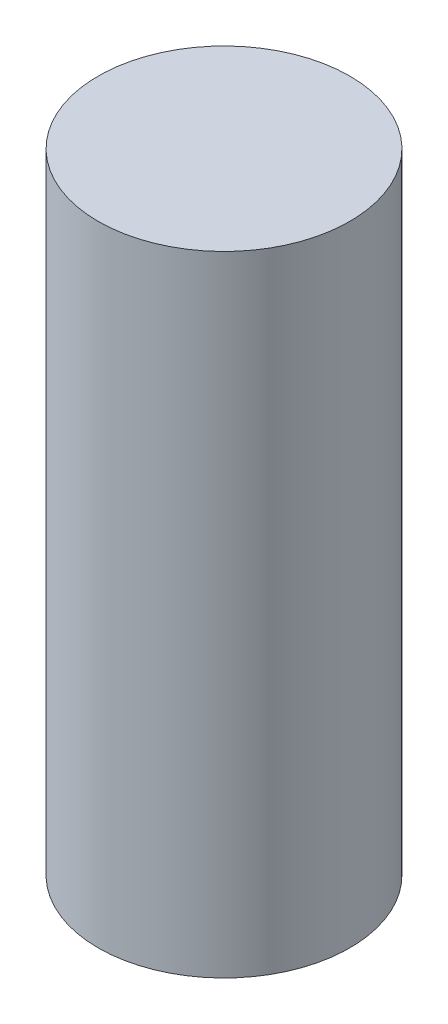
ISO-10303-21;
HEADER;
FILE_DESCRIPTION(('STEP AP214'),'2;1');
FILE_NAME('part.step','',(''),(''),'','','');
FILE_SCHEMA(('AUTOMOTIVE_DESIGN { 1 0 10303 214 1 1 1 1 }'));
ENDSEC;
DATA;
#1=APPLICATION_CONTEXT('core data for automotive mechanical design processes');
#2=APPLICATION_PROTOCOL_DEFINITION('international standard','automotive_design',2000,#1);
#3=PRODUCT_CONTEXT('',#1,'mechanical');
#4=PRODUCT('Part','Part','',(#3));
#5=PRODUCT_RELATED_PRODUCT_CATEGORY('part','',(#4));
#6=PRODUCT_DEFINITION_FORMATION('','',#4);
#7=PRODUCT_DEFINITION_CONTEXT('part definition',#1,'design');
#8=PRODUCT_DEFINITION('design','',#6,#7);
#9=PRODUCT_DEFINITION_SHAPE('','',#8);
#10=(LENGTH_UNIT() NAMED_UNIT(*) SI_UNIT(.MILLI.,.METRE.));
#11=(NAMED_UNIT(*) PLANE_ANGLE_UNIT() SI_UNIT($,.RADIAN.));
#12=(NAMED_UNIT(*) SI_UNIT($,.STERADIAN.) SOLID_ANGLE_UNIT());
#13=UNCERTAINTY_MEASURE_WITH_UNIT(LENGTH_MEASURE(1.E-05),#10,'distance_accuracy_value','');
#14=(GEOMETRIC_REPRESENTATION_CONTEXT(3) GLOBAL_UNCERTAINTY_ASSIGNED_CONTEXT((#13)) GLOBAL_UNIT_ASSIGNED_CONTEXT((#10,
#11,#12)) REPRESENTATION_CONTEXT('',''));
#15=CARTESIAN_POINT('',(0.,0.,0.));
#16=DIRECTION('',(0.,0.,1.));
#17=DIRECTION('',(1.,0.,0.));
#18=AXIS2_PLACEMENT_3D('',#15,#16,#17);
#19=CARTESIAN_POINT('',(0.,100.,0.));
#20=DIRECTION('',(0.,-1.,0.));
#21=DIRECTION('',(0.,0.,-1.));
#22=AXIS2_PLACEMENT_3D('',#19,#20,#21);
#23=CYLINDRICAL_SURFACE('',#22,20.);
#24=CARTESIAN_POINT('',(0.,100.,0.));
#25=DIRECTION('',(0.,1.,0.));
#26=DIRECTION('',(0.,0.,1.));
#27=AXIS2_PLACEMENT_3D('',#24,#25,#26);
#28=CIRCLE('',#27,20.);
#29=CARTESIAN_POINT('',(0.,100.,20.));
#30=VERTEX_POINT('',#29);
#31=EDGE_CURVE('E10',#30,#30,#28,.T.);
#32=ORIENTED_EDGE('',*,*,#31,.F.);
#33=EDGE_LOOP('',(#32));
#34=FACE_BOUND('',#33,.T.);
#35=CARTESIAN_POINT('',(0.,0.,0.));
#36=DIRECTION('',(0.,1.,0.));
#37=DIRECTION('',(0.,0.,1.));
#38=AXIS2_PLACEMENT_3D('',#35,#36,#37);
#39=CIRCLE('',#38,20.);
#40=CARTESIAN_POINT('',(0.,0.,20.));
#41=VERTEX_POINT('',#40);
#42=EDGE_CURVE('E44',#41,#41,#39,.T.);
#43=ORIENTED_EDGE('',*,*,#42,.T.);
#44=EDGE_LOOP('',(#43));
#45=FACE_BOUND('',#44,.T.);
#46=ADVANCED_FACE('F41',(#34,#45),#23,.T.);
#47=CARTESIAN_POINT('',(0.,100.,0.));
#48=DIRECTION('',(0.,1.,0.));
#49=DIRECTION('',(0.,0.,1.));
#50=AXIS2_PLACEMENT_3D('',#47,#48,#49);
#51=PLANE('',#50);
#52=ORIENTED_EDGE('',*,*,#31,.T.);
#53=EDGE_LOOP('',(#52));
#54=FACE_BOUND('',#53,.T.);
#55=ADVANCED_FACE('F56',(#54),#51,.T.);
#56=CARTESIAN_POINT('',(0.,0.,0.));
#57=DIRECTION('',(0.,1.,0.));
#58=DIRECTION('',(0.,0.,1.));
#59=AXIS2_PLACEMENT_3D('',#56,#57,#58);
#60=PLANE('',#59);
#61=ORIENTED_EDGE('',*,*,#42,.F.);
#62=EDGE_LOOP('',(#61));
#63=FACE_BOUND('',#62,.T.);
#64=ADVANCED_FACE('F54',(#63),#60,.F.);
#65=CLOSED_SHELL('',(#46,#55,#64));
#66=MANIFOLD_SOLID_BREP('B2',#65);
#67=ADVANCED_BREP_SHAPE_REPRESENTATION('',(#18,#66),#14);
#68=SHAPE_DEFINITION_REPRESENTATION(#9,#67);
ENDSEC;
END-ISO-10303-21;
